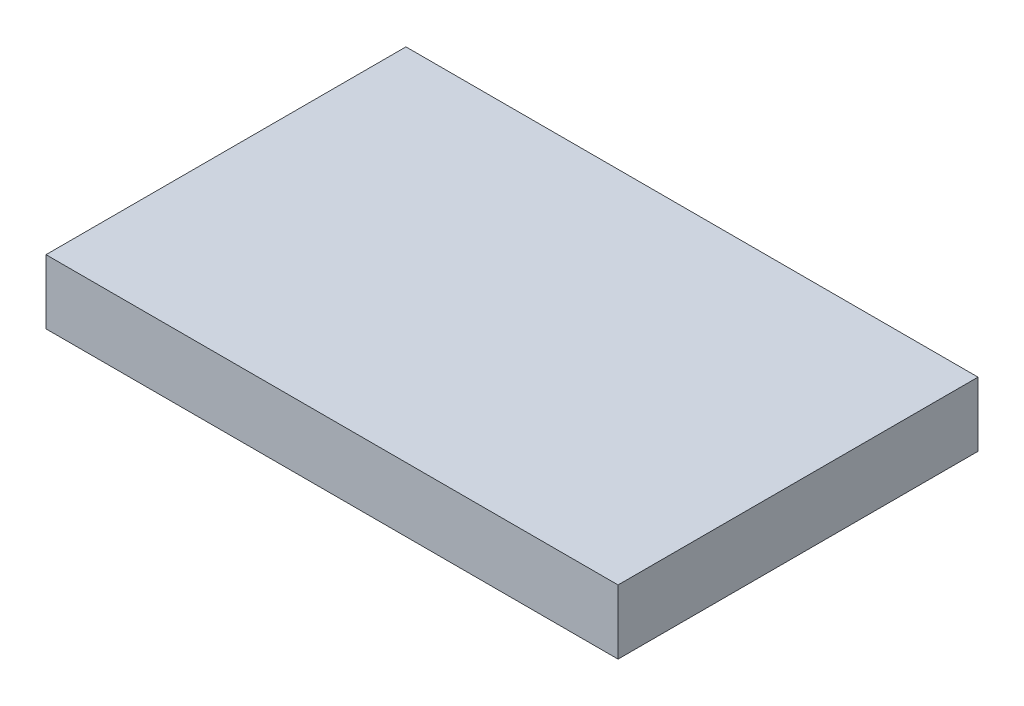
ISO-10303-21;
HEADER;
FILE_DESCRIPTION(('STEP AP214'),'2;1');
FILE_NAME('part.step','',(''),(''),'','','');
FILE_SCHEMA(('AUTOMOTIVE_DESIGN { 1 0 10303 214 1 1 1 1 }'));
ENDSEC;
DATA;
#1=APPLICATION_CONTEXT('core data for automotive mechanical design processes');
#2=APPLICATION_PROTOCOL_DEFINITION('international standard','automotive_design',2000,#1);
#3=PRODUCT_CONTEXT('',#1,'mechanical');
#4=PRODUCT('Part','Part','',(#3));
#5=PRODUCT_RELATED_PRODUCT_CATEGORY('part','',(#4));
#6=PRODUCT_DEFINITION_FORMATION('','',#4);
#7=PRODUCT_DEFINITION_CONTEXT('part definition',#1,'design');
#8=PRODUCT_DEFINITION('design','',#6,#7);
#9=PRODUCT_DEFINITION_SHAPE('','',#8);
#10=(LENGTH_UNIT() NAMED_UNIT(*) SI_UNIT(.MILLI.,.METRE.));
#11=(NAMED_UNIT(*) PLANE_ANGLE_UNIT() SI_UNIT($,.RADIAN.));
#12=(NAMED_UNIT(*) SI_UNIT($,.STERADIAN.) SOLID_ANGLE_UNIT());
#13=UNCERTAINTY_MEASURE_WITH_UNIT(LENGTH_MEASURE(1.E-05),#10,'distance_accuracy_value','');
#14=(GEOMETRIC_REPRESENTATION_CONTEXT(3) GLOBAL_UNCERTAINTY_ASSIGNED_CONTEXT((#13)) GLOBAL_UNIT_ASSIGNED_CONTEXT((#10,
#11,#12)) REPRESENTATION_CONTEXT('',''));
#15=CARTESIAN_POINT('',(0.,0.,0.));
#16=DIRECTION('',(0.,0.,1.));
#17=DIRECTION('',(1.,0.,0.));
#18=AXIS2_PLACEMENT_3D('',#15,#16,#17);
#19=CARTESIAN_POINT('',(44.5,5.,28.));
#20=DIRECTION('',(-1.,0.,0.));
#21=DIRECTION('',(0.,0.,1.));
#22=AXIS2_PLACEMENT_3D('',#19,#20,#21);
#23=PLANE('',#22);
#24=DIRECTION('',(0.,0.,-1.));
#25=VECTOR('',#24,1.);
#26=CARTESIAN_POINT('',(44.5,-5.,28.));
#27=LINE('',#26,#25);
#28=CARTESIAN_POINT('',(44.5,-5.,28.));
#29=VERTEX_POINT('',#28);
#30=CARTESIAN_POINT('',(44.5,-5.,-28.));
#31=VERTEX_POINT('',#30);
#32=EDGE_CURVE('E107',#29,#31,#27,.T.);
#33=ORIENTED_EDGE('',*,*,#32,.T.);
#34=DIRECTION('',(0.,-1.,0.));
#35=VECTOR('',#34,1.);
#36=CARTESIAN_POINT('',(44.5,5.,-28.));
#37=LINE('',#36,#35);
#38=CARTESIAN_POINT('',(44.5,5.,-28.));
#39=VERTEX_POINT('',#38);
#40=EDGE_CURVE('E11',#39,#31,#37,.T.);
#41=ORIENTED_EDGE('',*,*,#40,.F.);
#42=DIRECTION('',(0.,0.,-1.));
#43=VECTOR('',#42,1.);
#44=CARTESIAN_POINT('',(44.5,5.,28.));
#45=LINE('',#44,#43);
#46=CARTESIAN_POINT('',(44.5,5.,28.));
#47=VERTEX_POINT('',#46);
#48=EDGE_CURVE('E91',#47,#39,#45,.T.);
#49=ORIENTED_EDGE('',*,*,#48,.F.);
#50=DIRECTION('',(0.,-1.,0.));
#51=VECTOR('',#50,1.);
#52=CARTESIAN_POINT('',(44.5,5.,28.));
#53=LINE('',#52,#51);
#54=EDGE_CURVE('E103',#47,#29,#53,.T.);
#55=ORIENTED_EDGE('',*,*,#54,.T.);
#56=EDGE_LOOP('',(#33,#41,#49,#55));
#57=FACE_BOUND('',#56,.T.);
#58=ADVANCED_FACE('F39',(#57),#23,.F.);
#59=CARTESIAN_POINT('',(-44.5,5.,-28.));
#60=DIRECTION('',(0.,0.,1.));
#61=DIRECTION('',(1.,0.,0.));
#62=AXIS2_PLACEMENT_3D('',#59,#60,#61);
#63=PLANE('',#62);
#64=DIRECTION('',(-1.,0.,0.));
#65=VECTOR('',#64,1.);
#66=CARTESIAN_POINT('',(-44.5,-5.,-28.));
#67=LINE('',#66,#65);
#68=CARTESIAN_POINT('',(-44.5,-5.,-28.));
#69=VERTEX_POINT('',#68);
#70=EDGE_CURVE('E96',#31,#69,#67,.T.);
#71=ORIENTED_EDGE('',*,*,#70,.T.);
#72=DIRECTION('',(0.,-1.,0.));
#73=VECTOR('',#72,1.);
#74=CARTESIAN_POINT('',(-44.5,5.,-28.));
#75=LINE('',#74,#73);
#76=CARTESIAN_POINT('',(-44.5,5.,-28.));
#77=VERTEX_POINT('',#76);
#78=EDGE_CURVE('E48',#77,#69,#75,.T.);
#79=ORIENTED_EDGE('',*,*,#78,.F.);
#80=DIRECTION('',(-1.,0.,0.));
#81=VECTOR('',#80,1.);
#82=CARTESIAN_POINT('',(-44.5,5.,-28.));
#83=LINE('',#82,#81);
#84=EDGE_CURVE('E86',#39,#77,#83,.T.);
#85=ORIENTED_EDGE('',*,*,#84,.F.);
#86=ORIENTED_EDGE('',*,*,#40,.T.);
#87=EDGE_LOOP('',(#71,#79,#85,#86));
#88=FACE_BOUND('',#87,.T.);
#89=ADVANCED_FACE('F95',(#88),#63,.F.);
#90=CARTESIAN_POINT('',(-44.5,5.,28.));
#91=DIRECTION('',(1.,0.,0.));
#92=DIRECTION('',(0.,0.,-1.));
#93=AXIS2_PLACEMENT_3D('',#90,#91,#92);
#94=PLANE('',#93);
#95=DIRECTION('',(0.,0.,1.));
#96=VECTOR('',#95,1.);
#97=CARTESIAN_POINT('',(-44.5,-5.,28.));
#98=LINE('',#97,#96);
#99=CARTESIAN_POINT('',(-44.5,-5.,28.));
#100=VERTEX_POINT('',#99);
#101=EDGE_CURVE('E73',#69,#100,#98,.T.);
#102=ORIENTED_EDGE('',*,*,#101,.T.);
#103=DIRECTION('',(0.,-1.,0.));
#104=VECTOR('',#103,1.);
#105=CARTESIAN_POINT('',(-44.5,5.,28.));
#106=LINE('',#105,#104);
#107=CARTESIAN_POINT('',(-44.5,5.,28.));
#108=VERTEX_POINT('',#107);
#109=EDGE_CURVE('E98',#108,#100,#106,.T.);
#110=ORIENTED_EDGE('',*,*,#109,.F.);
#111=DIRECTION('',(0.,0.,1.));
#112=VECTOR('',#111,1.);
#113=CARTESIAN_POINT('',(-44.5,5.,28.));
#114=LINE('',#113,#112);
#115=EDGE_CURVE('E89',#77,#108,#114,.T.);
#116=ORIENTED_EDGE('',*,*,#115,.F.);
#117=ORIENTED_EDGE('',*,*,#78,.T.);
#118=EDGE_LOOP('',(#102,#110,#116,#117));
#119=FACE_BOUND('',#118,.T.);
#120=ADVANCED_FACE('F99',(#119),#94,.F.);
#121=CARTESIAN_POINT('',(-44.5,5.,28.));
#122=DIRECTION('',(0.,0.,-1.));
#123=DIRECTION('',(-1.,0.,0.));
#124=AXIS2_PLACEMENT_3D('',#121,#122,#123);
#125=PLANE('',#124);
#126=DIRECTION('',(1.,0.,0.));
#127=VECTOR('',#126,1.);
#128=CARTESIAN_POINT('',(-44.5,-5.,28.));
#129=LINE('',#128,#127);
#130=EDGE_CURVE('E79',#100,#29,#129,.T.);
#131=ORIENTED_EDGE('',*,*,#130,.T.);
#132=ORIENTED_EDGE('',*,*,#54,.F.);
#133=DIRECTION('',(1.,0.,0.));
#134=VECTOR('',#133,1.);
#135=CARTESIAN_POINT('',(-44.5,5.,28.));
#136=LINE('',#135,#134);
#137=EDGE_CURVE('E56',#108,#47,#136,.T.);
#138=ORIENTED_EDGE('',*,*,#137,.F.);
#139=ORIENTED_EDGE('',*,*,#109,.T.);
#140=EDGE_LOOP('',(#131,#132,#138,#139));
#141=FACE_BOUND('',#140,.T.);
#142=ADVANCED_FACE('F120',(#141),#125,.F.);
#143=CARTESIAN_POINT('',(0.,5.,0.));
#144=DIRECTION('',(0.,-1.,0.));
#145=DIRECTION('',(0.,0.,-1.));
#146=AXIS2_PLACEMENT_3D('',#143,#144,#145);
#147=PLANE('',#146);
#148=ORIENTED_EDGE('',*,*,#48,.T.);
#149=ORIENTED_EDGE('',*,*,#84,.T.);
#150=ORIENTED_EDGE('',*,*,#115,.T.);
#151=ORIENTED_EDGE('',*,*,#137,.T.);
#152=EDGE_LOOP('',(#148,#149,#150,#151));
#153=FACE_BOUND('',#152,.T.);
#154=ADVANCED_FACE('F87',(#153),#147,.F.);
#155=CARTESIAN_POINT('',(0.,-5.,0.));
#156=DIRECTION('',(0.,-1.,0.));
#157=DIRECTION('',(0.,0.,-1.));
#158=AXIS2_PLACEMENT_3D('',#155,#156,#157);
#159=PLANE('',#158);
#160=ORIENTED_EDGE('',*,*,#32,.F.);
#161=ORIENTED_EDGE('',*,*,#130,.F.);
#162=ORIENTED_EDGE('',*,*,#101,.F.);
#163=ORIENTED_EDGE('',*,*,#70,.F.);
#164=EDGE_LOOP('',(#160,#161,#162,#163));
#165=FACE_BOUND('',#164,.T.);
#166=ADVANCED_FACE('F123',(#165),#159,.T.);
#167=CLOSED_SHELL('',(#58,#89,#120,#142,#154,#166));
#168=MANIFOLD_SOLID_BREP('B2',#167);
#169=ADVANCED_BREP_SHAPE_REPRESENTATION('',(#18,#168),#14);
#170=SHAPE_DEFINITION_REPRESENTATION(#9,#169);
ENDSEC;
END-ISO-10303-21;
